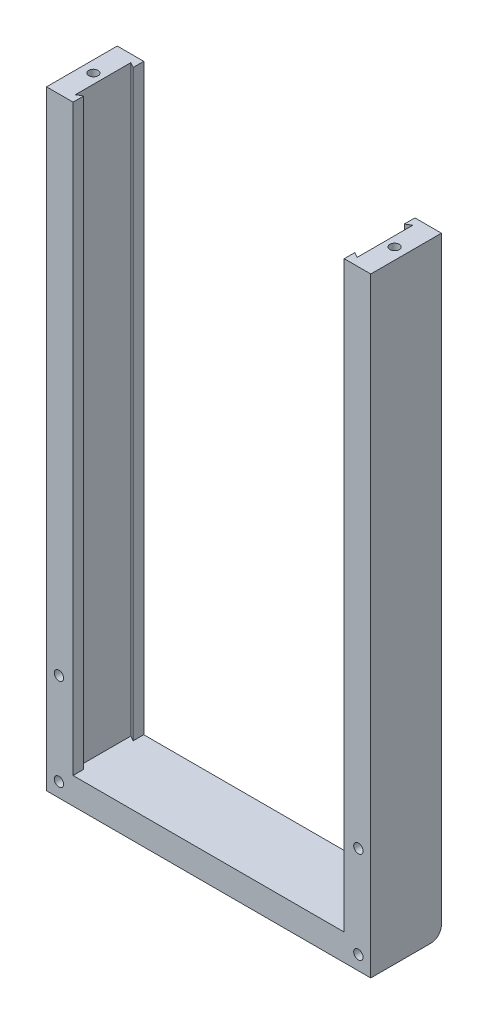
ISO-10303-21;
HEADER;
FILE_DESCRIPTION(('STEP AP214'),'2;1');
FILE_NAME('part.step','',(''),(''),'','','');
FILE_SCHEMA(('AUTOMOTIVE_DESIGN { 1 0 10303 214 1 1 1 1 }'));
ENDSEC;
DATA;
#1=APPLICATION_CONTEXT('core data for automotive mechanical design processes');
#2=APPLICATION_PROTOCOL_DEFINITION('international standard','automotive_design',2000,#1);
#3=PRODUCT_CONTEXT('',#1,'mechanical');
#4=PRODUCT('Part','Part','',(#3));
#5=PRODUCT_RELATED_PRODUCT_CATEGORY('part','',(#4));
#6=PRODUCT_DEFINITION_FORMATION('','',#4);
#7=PRODUCT_DEFINITION_CONTEXT('part definition',#1,'design');
#8=PRODUCT_DEFINITION('design','',#6,#7);
#9=PRODUCT_DEFINITION_SHAPE('','',#8);
#10=(LENGTH_UNIT() NAMED_UNIT(*) SI_UNIT(.MILLI.,.METRE.));
#11=(NAMED_UNIT(*) PLANE_ANGLE_UNIT() SI_UNIT($,.RADIAN.));
#12=(NAMED_UNIT(*) SI_UNIT($,.STERADIAN.) SOLID_ANGLE_UNIT());
#13=UNCERTAINTY_MEASURE_WITH_UNIT(LENGTH_MEASURE(1.E-05),#10,'distance_accuracy_value','');
#14=(GEOMETRIC_REPRESENTATION_CONTEXT(3) GLOBAL_UNCERTAINTY_ASSIGNED_CONTEXT((#13)) GLOBAL_UNIT_ASSIGNED_CONTEXT((#10,
#11,#12)) REPRESENTATION_CONTEXT('',''));
#15=CARTESIAN_POINT('',(0.,0.,0.));
#16=DIRECTION('',(0.,0.,1.));
#17=DIRECTION('',(1.,0.,0.));
#18=AXIS2_PLACEMENT_3D('',#15,#16,#17);
#19=CARTESIAN_POINT('',(38.36,82.5,-181.964167901266));
#20=DIRECTION('',(-1.,0.,0.));
#21=DIRECTION('',(0.,-1.,0.));
#22=AXIS2_PLACEMENT_3D('',#19,#20,#21);
#23=PLANE('',#22);
#24=DIRECTION('',(0.,1.,0.));
#25=VECTOR('',#24,1.);
#26=CARTESIAN_POINT('',(38.36,-98.3033990841189,17.));
#27=LINE('',#26,#25);
#28=CARTESIAN_POINT('',(38.36,-82.5,17.));
#29=VERTEX_POINT('',#28);
#30=CARTESIAN_POINT('',(38.36,82.5,17.));
#31=VERTEX_POINT('',#30);
#32=EDGE_CURVE('E223',#29,#31,#27,.T.);
#33=ORIENTED_EDGE('',*,*,#32,.F.);
#34=DIRECTION('',(0.,0.,1.));
#35=VECTOR('',#34,1.);
#36=CARTESIAN_POINT('',(38.36,-82.5,-181.964167901266));
#37=LINE('',#36,#35);
#38=CARTESIAN_POINT('',(38.36,-82.5,20.));
#39=VERTEX_POINT('',#38);
#40=EDGE_CURVE('E284',#29,#39,#37,.T.);
#41=ORIENTED_EDGE('',*,*,#40,.T.);
#42=DIRECTION('',(0.,-1.,0.));
#43=VECTOR('',#42,1.);
#44=CARTESIAN_POINT('',(38.36,82.5,20.));
#45=LINE('',#44,#43);
#46=CARTESIAN_POINT('',(38.36,82.5,20.));
#47=VERTEX_POINT('',#46);
#48=EDGE_CURVE('E285',#47,#39,#45,.T.);
#49=ORIENTED_EDGE('',*,*,#48,.F.);
#50=DIRECTION('',(0.,0.,1.));
#51=VECTOR('',#50,1.);
#52=CARTESIAN_POINT('',(38.36,82.5,-181.964167901266));
#53=LINE('',#52,#51);
#54=EDGE_CURVE('E54',#31,#47,#53,.T.);
#55=ORIENTED_EDGE('',*,*,#54,.F.);
#56=EDGE_LOOP('',(#33,#41,#49,#55));
#57=FACE_BOUND('',#56,.T.);
#58=ADVANCED_FACE('F45',(#57),#23,.T.);
#59=CARTESIAN_POINT('',(-38.36,82.5,-181.964167901266));
#60=DIRECTION('',(-1.,0.,0.));
#61=DIRECTION('',(0.,0.,1.));
#62=AXIS2_PLACEMENT_3D('',#59,#60,#61);
#63=PLANE('',#62);
#64=DIRECTION('',(0.,0.,1.));
#65=VECTOR('',#64,1.);
#66=CARTESIAN_POINT('',(-38.36,-82.5,-181.964167901266));
#67=LINE('',#66,#65);
#68=CARTESIAN_POINT('',(-38.36,-82.5,17.));
#69=VERTEX_POINT('',#68);
#70=CARTESIAN_POINT('',(-38.36,-82.5,20.));
#71=VERTEX_POINT('',#70);
#72=EDGE_CURVE('E312',#69,#71,#67,.T.);
#73=ORIENTED_EDGE('',*,*,#72,.F.);
#74=DIRECTION('',(0.,1.,0.));
#75=VECTOR('',#74,1.);
#76=CARTESIAN_POINT('',(-38.36,-98.3033990841189,17.));
#77=LINE('',#76,#75);
#78=CARTESIAN_POINT('',(-38.36,82.5,17.));
#79=VERTEX_POINT('',#78);
#80=EDGE_CURVE('E191',#69,#79,#77,.T.);
#81=ORIENTED_EDGE('',*,*,#80,.T.);
#82=DIRECTION('',(0.,0.,1.));
#83=VECTOR('',#82,1.);
#84=CARTESIAN_POINT('',(-38.36,82.5,-181.964167901266));
#85=LINE('',#84,#83);
#86=CARTESIAN_POINT('',(-38.36,82.5,20.));
#87=VERTEX_POINT('',#86);
#88=EDGE_CURVE('E316',#79,#87,#85,.T.);
#89=ORIENTED_EDGE('',*,*,#88,.T.);
#90=DIRECTION('',(0.,-1.,0.));
#91=VECTOR('',#90,1.);
#92=CARTESIAN_POINT('',(-38.36,82.5,20.));
#93=LINE('',#92,#91);
#94=EDGE_CURVE('E302',#87,#71,#93,.T.);
#95=ORIENTED_EDGE('',*,*,#94,.T.);
#96=EDGE_LOOP('',(#73,#81,#89,#95));
#97=FACE_BOUND('',#96,.T.);
#98=ADVANCED_FACE('F408',(#97),#63,.F.);
#99=CARTESIAN_POINT('',(-45.86,82.5,-0.0100000000000031));
#100=DIRECTION('',(0.,-1.,0.));
#101=DIRECTION('',(0.,0.,-1.));
#102=AXIS2_PLACEMENT_3D('',#99,#100,#101);
#103=PLANE('',#102);
#104=DIRECTION('',(0.,0.,-1.));
#105=VECTOR('',#104,1.);
#106=CARTESIAN_POINT('',(39.86,82.5,17.8660254037844));
#107=LINE('',#106,#105);
#108=CARTESIAN_POINT('',(39.86,82.5,17.8660254037844));
#109=VERTEX_POINT('',#108);
#110=CARTESIAN_POINT('',(39.86,82.5,2.13397459621555));
#111=VERTEX_POINT('',#110);
#112=EDGE_CURVE('E225',#109,#111,#107,.T.);
#113=ORIENTED_EDGE('',*,*,#112,.F.);
#114=DIRECTION('',(0.866025403784438,0.,0.500000000000001));
#115=VECTOR('',#114,1.);
#116=CARTESIAN_POINT('',(38.36,82.5,17.));
#117=LINE('',#116,#115);
#118=EDGE_CURVE('E238',#31,#109,#117,.T.);
#119=ORIENTED_EDGE('',*,*,#118,.F.);
#120=ORIENTED_EDGE('',*,*,#54,.T.);
#121=DIRECTION('',(-1.,0.,0.));
#122=VECTOR('',#121,1.);
#123=CARTESIAN_POINT('',(0.,82.5,20.));
#124=LINE('',#123,#122);
#125=CARTESIAN_POINT('',(45.86,82.5,20.));
#126=VERTEX_POINT('',#125);
#127=EDGE_CURVE('E448',#126,#47,#124,.T.);
#128=ORIENTED_EDGE('',*,*,#127,.F.);
#129=DIRECTION('',(0.,0.,1.));
#130=VECTOR('',#129,1.);
#131=CARTESIAN_POINT('',(45.86,82.5,-0.0100000000000031));
#132=LINE('',#131,#130);
#133=CARTESIAN_POINT('',(45.86,82.5,0.));
#134=VERTEX_POINT('',#133);
#135=EDGE_CURVE('E458',#134,#126,#132,.T.);
#136=ORIENTED_EDGE('',*,*,#135,.F.);
#137=DIRECTION('',(-1.,0.,0.));
#138=VECTOR('',#137,1.);
#139=CARTESIAN_POINT('',(0.,82.5,0.));
#140=LINE('',#139,#138);
#141=CARTESIAN_POINT('',(38.36,82.5,0.));
#142=VERTEX_POINT('',#141);
#143=EDGE_CURVE('E450',#134,#142,#140,.T.);
#144=ORIENTED_EDGE('',*,*,#143,.T.);
#145=CARTESIAN_POINT('',(38.36,82.5,3.00000000000003));
#146=VERTEX_POINT('',#145);
#147=EDGE_CURVE('E11',#142,#146,#53,.T.);
#148=ORIENTED_EDGE('',*,*,#147,.T.);
#149=DIRECTION('',(-0.866025403784435,0.,0.500000000000006));
#150=VECTOR('',#149,1.);
#151=CARTESIAN_POINT('',(39.86,82.5,2.13397459621555));
#152=LINE('',#151,#150);
#153=EDGE_CURVE('E62',#111,#146,#152,.T.);
#154=ORIENTED_EDGE('',*,*,#153,.F.);
#155=EDGE_LOOP('',(#113,#119,#120,#128,#136,#144,#148,#154));
#156=FACE_BOUND('',#155,.T.);
#157=CARTESIAN_POINT('',(42.61,82.5,10.));
#158=DIRECTION('',(0.,-1.,0.));
#159=DIRECTION('',(0.,0.,-1.));
#160=AXIS2_PLACEMENT_3D('',#157,#158,#159);
#161=CIRCLE('',#160,1.3208);
#162=CARTESIAN_POINT('',(42.61,82.5,8.6792));
#163=VERTEX_POINT('',#162);
#164=EDGE_CURVE('E459',#163,#163,#161,.F.);
#165=ORIENTED_EDGE('',*,*,#164,.F.);
#166=EDGE_LOOP('',(#165));
#167=FACE_BOUND('',#166,.T.);
#168=ADVANCED_FACE('F47',(#156,#167),#103,.F.);
#169=ORIENTED_EDGE('',*,*,#88,.F.);
#170=DIRECTION('',(0.866025403784436,0.,-0.500000000000004));
#171=VECTOR('',#170,1.);
#172=CARTESIAN_POINT('',(-38.36,82.5,17.));
#173=LINE('',#172,#171);
#174=CARTESIAN_POINT('',(-39.86,82.5,17.8660254037845));
#175=VERTEX_POINT('',#174);
#176=EDGE_CURVE('E206',#175,#79,#173,.T.);
#177=ORIENTED_EDGE('',*,*,#176,.F.);
#178=DIRECTION('',(0.,0.,1.));
#179=VECTOR('',#178,1.);
#180=CARTESIAN_POINT('',(-39.86,82.5,17.8660254037845));
#181=LINE('',#180,#179);
#182=CARTESIAN_POINT('',(-39.86,82.5,2.13397459621555));
#183=VERTEX_POINT('',#182);
#184=EDGE_CURVE('E200',#183,#175,#181,.T.);
#185=ORIENTED_EDGE('',*,*,#184,.F.);
#186=DIRECTION('',(-0.866025403784436,0.,-0.500000000000004));
#187=VECTOR('',#186,1.);
#188=CARTESIAN_POINT('',(-39.86,82.5,2.13397459621555));
#189=LINE('',#188,#187);
#190=CARTESIAN_POINT('',(-38.36,82.5,3.));
#191=VERTEX_POINT('',#190);
#192=EDGE_CURVE('E211',#191,#183,#189,.T.);
#193=ORIENTED_EDGE('',*,*,#192,.F.);
#194=CARTESIAN_POINT('',(-38.36,82.5,0.));
#195=VERTEX_POINT('',#194);
#196=EDGE_CURVE('E308',#195,#191,#85,.T.);
#197=ORIENTED_EDGE('',*,*,#196,.F.);
#198=CARTESIAN_POINT('',(-45.86,82.5,0.));
#199=VERTEX_POINT('',#198);
#200=EDGE_CURVE('E49',#195,#199,#140,.T.);
#201=ORIENTED_EDGE('',*,*,#200,.T.);
#202=DIRECTION('',(0.,0.,-1.));
#203=VECTOR('',#202,1.);
#204=CARTESIAN_POINT('',(-45.86,82.5,20.));
#205=LINE('',#204,#203);
#206=CARTESIAN_POINT('',(-45.86,82.5,20.));
#207=VERTEX_POINT('',#206);
#208=EDGE_CURVE('E454',#207,#199,#205,.T.);
#209=ORIENTED_EDGE('',*,*,#208,.F.);
#210=EDGE_CURVE('E451',#87,#207,#124,.T.);
#211=ORIENTED_EDGE('',*,*,#210,.F.);
#212=EDGE_LOOP('',(#169,#177,#185,#193,#197,#201,#209,#211));
#213=FACE_BOUND('',#212,.T.);
#214=CARTESIAN_POINT('',(-42.61,82.5,10.));
#215=DIRECTION('',(0.,-1.,0.));
#216=DIRECTION('',(0.,0.,-1.));
#217=AXIS2_PLACEMENT_3D('',#214,#215,#216);
#218=CIRCLE('',#217,1.3208);
#219=CARTESIAN_POINT('',(-42.61,82.5,8.6792));
#220=VERTEX_POINT('',#219);
#221=EDGE_CURVE('E461',#220,#220,#218,.F.);
#222=ORIENTED_EDGE('',*,*,#221,.F.);
#223=EDGE_LOOP('',(#222));
#224=FACE_BOUND('',#223,.T.);
#225=ADVANCED_FACE('F421',(#213,#224),#103,.F.);
#226=CARTESIAN_POINT('',(-42.61,70.,10.));
#227=DIRECTION('',(0.,1.,0.));
#228=DIRECTION('',(0.,0.,1.));
#229=AXIS2_PLACEMENT_3D('',#226,#227,#228);
#230=CONICAL_SURFACE('',#229,1.3208,1.02974425867666);
#231=CARTESIAN_POINT('',(-42.61,69.2063832943884,10.));
#232=VERTEX_POINT('',#231);
#233=VERTEX_LOOP('',#232);
#234=FACE_BOUND('',#233,.T.);
#235=CARTESIAN_POINT('',(-42.61,70.,10.));
#236=DIRECTION('',(0.,1.,0.));
#237=DIRECTION('',(0.,0.,1.));
#238=AXIS2_PLACEMENT_3D('',#235,#236,#237);
#239=CIRCLE('',#238,1.3208);
#240=CARTESIAN_POINT('',(-42.61,70.,11.3208));
#241=VERTEX_POINT('',#240);
#242=EDGE_CURVE('E219',#241,#241,#239,.T.);
#243=ORIENTED_EDGE('',*,*,#242,.T.);
#244=EDGE_LOOP('',(#243));
#245=FACE_BOUND('',#244,.T.);
#246=ADVANCED_FACE('F520',(#234,#245),#230,.F.);
#247=CARTESIAN_POINT('',(-42.61,90.,10.));
#248=DIRECTION('',(0.,1.,0.));
#249=DIRECTION('',(0.,0.,1.));
#250=AXIS2_PLACEMENT_3D('',#247,#248,#249);
#251=CYLINDRICAL_SURFACE('',#250,1.3208);
#252=ORIENTED_EDGE('',*,*,#221,.T.);
#253=EDGE_LOOP('',(#252));
#254=FACE_BOUND('',#253,.T.);
#255=ORIENTED_EDGE('',*,*,#242,.F.);
#256=EDGE_LOOP('',(#255));
#257=FACE_BOUND('',#256,.T.);
#258=ADVANCED_FACE('F526',(#254,#257),#251,.F.);
#259=CARTESIAN_POINT('',(42.61,70.,10.));
#260=DIRECTION('',(0.,1.,0.));
#261=DIRECTION('',(0.,0.,1.));
#262=AXIS2_PLACEMENT_3D('',#259,#260,#261);
#263=CONICAL_SURFACE('',#262,1.3208,1.02974425867666);
#264=CARTESIAN_POINT('',(42.61,69.2063832943884,10.));
#265=VERTEX_POINT('',#264);
#266=VERTEX_LOOP('',#265);
#267=FACE_BOUND('',#266,.T.);
#268=CARTESIAN_POINT('',(42.61,70.,10.));
#269=DIRECTION('',(0.,1.,0.));
#270=DIRECTION('',(0.,0.,1.));
#271=AXIS2_PLACEMENT_3D('',#268,#269,#270);
#272=CIRCLE('',#271,1.3208);
#273=CARTESIAN_POINT('',(42.61,70.,11.3208));
#274=VERTEX_POINT('',#273);
#275=EDGE_CURVE('E245',#274,#274,#272,.T.);
#276=ORIENTED_EDGE('',*,*,#275,.T.);
#277=EDGE_LOOP('',(#276));
#278=FACE_BOUND('',#277,.T.);
#279=ADVANCED_FACE('F364',(#267,#278),#263,.F.);
#280=CARTESIAN_POINT('',(42.61,90.,10.));
#281=DIRECTION('',(0.,1.,0.));
#282=DIRECTION('',(0.,0.,1.));
#283=AXIS2_PLACEMENT_3D('',#280,#281,#282);
#284=CYLINDRICAL_SURFACE('',#283,1.3208);
#285=ORIENTED_EDGE('',*,*,#164,.T.);
#286=EDGE_LOOP('',(#285));
#287=FACE_BOUND('',#286,.T.);
#288=ORIENTED_EDGE('',*,*,#275,.F.);
#289=EDGE_LOOP('',(#288));
#290=FACE_BOUND('',#289,.T.);
#291=ADVANCED_FACE('F392',(#287,#290),#284,.F.);
#292=CARTESIAN_POINT('',(42.36,-60.,0.));
#293=DIRECTION('',(0.,0.,-1.));
#294=DIRECTION('',(-1.,0.,0.));
#295=AXIS2_PLACEMENT_3D('',#292,#293,#294);
#296=CYLINDRICAL_SURFACE('',#295,1.32079999999999);
#297=CARTESIAN_POINT('',(42.36,-60.,20.));
#298=DIRECTION('',(0.,0.,-1.));
#299=DIRECTION('',(-1.,0.,0.));
#300=AXIS2_PLACEMENT_3D('',#297,#298,#299);
#301=CIRCLE('',#300,1.3208);
#302=CARTESIAN_POINT('',(41.0392,-60.,20.));
#303=VERTEX_POINT('',#302);
#304=EDGE_CURVE('E281',#303,#303,#301,.T.);
#305=ORIENTED_EDGE('',*,*,#304,.F.);
#306=EDGE_LOOP('',(#305));
#307=FACE_BOUND('',#306,.T.);
#308=CARTESIAN_POINT('',(42.36,-60.,1.0123737050154));
#309=DIRECTION('',(0.,0.,-1.));
#310=DIRECTION('',(-1.,0.,0.));
#311=AXIS2_PLACEMENT_3D('',#308,#309,#310);
#312=CIRCLE('',#311,1.32079999999998);
#313=CARTESIAN_POINT('',(41.0392,-60.,1.0123737050154));
#314=VERTEX_POINT('',#313);
#315=EDGE_CURVE('E278',#314,#314,#312,.T.);
#316=ORIENTED_EDGE('',*,*,#315,.T.);
#317=EDGE_LOOP('',(#316));
#318=FACE_BOUND('',#317,.T.);
#319=ADVANCED_FACE('F385',(#307,#318),#296,.F.);
#320=CARTESIAN_POINT('',(-42.36,-60.,0.));
#321=DIRECTION('',(0.,0.,-1.));
#322=DIRECTION('',(-1.,0.,0.));
#323=AXIS2_PLACEMENT_3D('',#320,#321,#322);
#324=CYLINDRICAL_SURFACE('',#323,1.32079999999999);
#325=CARTESIAN_POINT('',(-42.36,-60.,20.));
#326=DIRECTION('',(0.,0.,-1.));
#327=DIRECTION('',(-1.,0.,0.));
#328=AXIS2_PLACEMENT_3D('',#325,#326,#327);
#329=CIRCLE('',#328,1.3208);
#330=CARTESIAN_POINT('',(-43.6808,-60.,20.));
#331=VERTEX_POINT('',#330);
#332=EDGE_CURVE('E272',#331,#331,#329,.T.);
#333=ORIENTED_EDGE('',*,*,#332,.F.);
#334=EDGE_LOOP('',(#333));
#335=FACE_BOUND('',#334,.T.);
#336=CARTESIAN_POINT('',(-42.36,-60.,1.0123737050154));
#337=DIRECTION('',(0.,0.,-1.));
#338=DIRECTION('',(-1.,0.,0.));
#339=AXIS2_PLACEMENT_3D('',#336,#337,#338);
#340=CIRCLE('',#339,1.32079999999998);
#341=CARTESIAN_POINT('',(-43.6808,-60.,1.0123737050154));
#342=VERTEX_POINT('',#341);
#343=EDGE_CURVE('E269',#342,#342,#340,.T.);
#344=ORIENTED_EDGE('',*,*,#343,.T.);
#345=EDGE_LOOP('',(#344));
#346=FACE_BOUND('',#345,.T.);
#347=ADVANCED_FACE('F378',(#335,#346),#324,.F.);
#348=CARTESIAN_POINT('',(-42.36,-86.,0.));
#349=DIRECTION('',(0.,0.,-1.));
#350=DIRECTION('',(-1.,0.,0.));
#351=AXIS2_PLACEMENT_3D('',#348,#349,#350);
#352=CYLINDRICAL_SURFACE('',#351,1.32079999999999);
#353=CARTESIAN_POINT('',(-42.36,-86.,20.));
#354=DIRECTION('',(0.,0.,-1.));
#355=DIRECTION('',(-1.,0.,0.));
#356=AXIS2_PLACEMENT_3D('',#353,#354,#355);
#357=CIRCLE('',#356,1.3208);
#358=CARTESIAN_POINT('',(-43.6808,-86.,20.));
#359=VERTEX_POINT('',#358);
#360=EDGE_CURVE('E263',#359,#359,#357,.T.);
#361=ORIENTED_EDGE('',*,*,#360,.F.);
#362=EDGE_LOOP('',(#361));
#363=FACE_BOUND('',#362,.T.);
#364=CARTESIAN_POINT('',(-42.36,-86.,1.0123737050154));
#365=DIRECTION('',(0.,0.,-1.));
#366=DIRECTION('',(-1.,0.,0.));
#367=AXIS2_PLACEMENT_3D('',#364,#365,#366);
#368=CIRCLE('',#367,1.32079999999998);
#369=CARTESIAN_POINT('',(-43.6808,-86.,1.0123737050154));
#370=VERTEX_POINT('',#369);
#371=EDGE_CURVE('E260',#370,#370,#368,.T.);
#372=ORIENTED_EDGE('',*,*,#371,.T.);
#373=EDGE_LOOP('',(#372));
#374=FACE_BOUND('',#373,.T.);
#375=ADVANCED_FACE('F369',(#363,#374),#352,.F.);
#376=CARTESIAN_POINT('',(42.36,-86.,0.));
#377=DIRECTION('',(0.,0.,-1.));
#378=DIRECTION('',(-1.,0.,0.));
#379=AXIS2_PLACEMENT_3D('',#376,#377,#378);
#380=CYLINDRICAL_SURFACE('',#379,1.32079999999999);
#381=CARTESIAN_POINT('',(42.36,-86.,20.));
#382=DIRECTION('',(0.,0.,-1.));
#383=DIRECTION('',(-1.,0.,0.));
#384=AXIS2_PLACEMENT_3D('',#381,#382,#383);
#385=CIRCLE('',#384,1.3208);
#386=CARTESIAN_POINT('',(41.0392,-86.,20.));
#387=VERTEX_POINT('',#386);
#388=EDGE_CURVE('E254',#387,#387,#385,.T.);
#389=ORIENTED_EDGE('',*,*,#388,.F.);
#390=EDGE_LOOP('',(#389));
#391=FACE_BOUND('',#390,.T.);
#392=CARTESIAN_POINT('',(42.36,-86.,1.0123737050154));
#393=DIRECTION('',(0.,0.,-1.));
#394=DIRECTION('',(-1.,0.,0.));
#395=AXIS2_PLACEMENT_3D('',#392,#393,#394);
#396=CIRCLE('',#395,1.32079999999998);
#397=CARTESIAN_POINT('',(41.0392,-86.,1.0123737050154));
#398=VERTEX_POINT('',#397);
#399=EDGE_CURVE('E251',#398,#398,#396,.T.);
#400=ORIENTED_EDGE('',*,*,#399,.T.);
#401=EDGE_LOOP('',(#400));
#402=FACE_BOUND('',#401,.T.);
#403=ADVANCED_FACE('F366',(#391,#402),#380,.F.);
#404=CARTESIAN_POINT('',(42.36,-60.,0.));
#405=DIRECTION('',(0.,0.,-1.));
#406=DIRECTION('',(-1.,0.,0.));
#407=AXIS2_PLACEMENT_3D('',#404,#405,#406);
#408=CONICAL_SURFACE('',#407,2.5273,0.872664625997162);
#409=ORIENTED_EDGE('',*,*,#315,.F.);
#410=EDGE_LOOP('',(#409));
#411=FACE_BOUND('',#410,.T.);
#412=CARTESIAN_POINT('',(42.36,-60.,0.));
#413=DIRECTION('',(0.,0.,-1.));
#414=DIRECTION('',(-1.,0.,0.));
#415=AXIS2_PLACEMENT_3D('',#412,#413,#414);
#416=CIRCLE('',#415,2.5273);
#417=CARTESIAN_POINT('',(39.8327,-60.,0.));
#418=VERTEX_POINT('',#417);
#419=EDGE_CURVE('E275',#418,#418,#416,.T.);
#420=ORIENTED_EDGE('',*,*,#419,.T.);
#421=EDGE_LOOP('',(#420));
#422=FACE_BOUND('',#421,.T.);
#423=ADVANCED_FACE('F368',(#411,#422),#408,.F.);
#424=CARTESIAN_POINT('',(-42.36,-60.,0.));
#425=DIRECTION('',(0.,0.,-1.));
#426=DIRECTION('',(-1.,0.,0.));
#427=AXIS2_PLACEMENT_3D('',#424,#425,#426);
#428=CONICAL_SURFACE('',#427,2.5273,0.872664625997162);
#429=ORIENTED_EDGE('',*,*,#343,.F.);
#430=EDGE_LOOP('',(#429));
#431=FACE_BOUND('',#430,.T.);
#432=CARTESIAN_POINT('',(-42.36,-60.,0.));
#433=DIRECTION('',(0.,0.,-1.));
#434=DIRECTION('',(-1.,0.,0.));
#435=AXIS2_PLACEMENT_3D('',#432,#433,#434);
#436=CIRCLE('',#435,2.5273);
#437=CARTESIAN_POINT('',(-44.8873,-60.,0.));
#438=VERTEX_POINT('',#437);
#439=EDGE_CURVE('E266',#438,#438,#436,.T.);
#440=ORIENTED_EDGE('',*,*,#439,.T.);
#441=EDGE_LOOP('',(#440));
#442=FACE_BOUND('',#441,.T.);
#443=ADVANCED_FACE('F374',(#431,#442),#428,.F.);
#444=CARTESIAN_POINT('',(-42.36,-86.,0.));
#445=DIRECTION('',(0.,0.,-1.));
#446=DIRECTION('',(-1.,0.,0.));
#447=AXIS2_PLACEMENT_3D('',#444,#445,#446);
#448=CONICAL_SURFACE('',#447,2.5273,0.872664625997162);
#449=ORIENTED_EDGE('',*,*,#371,.F.);
#450=EDGE_LOOP('',(#449));
#451=FACE_BOUND('',#450,.T.);
#452=CARTESIAN_POINT('',(-42.36,-86.,0.));
#453=DIRECTION('',(0.,0.,-1.));
#454=DIRECTION('',(-1.,0.,0.));
#455=AXIS2_PLACEMENT_3D('',#452,#453,#454);
#456=CIRCLE('',#455,2.5273);
#457=CARTESIAN_POINT('',(-44.6810440086306,-87.,0.));
#458=VERTEX_POINT('',#457);
#459=CARTESIAN_POINT('',(-40.0389559913694,-87.,0.));
#460=VERTEX_POINT('',#459);
#461=EDGE_CURVE('E257',#458,#460,#456,.T.);
#462=ORIENTED_EDGE('',*,*,#461,.T.);
#463=CARTESIAN_POINT('',(-40.0389559913694,-87.,0.));
#464=CARTESIAN_POINT('',(-40.0746672007074,-87.0829527322938,1.03523045244212E-05));
#465=CARTESIAN_POINT('',(-40.118376490096,-87.1617879689519,0.00343635822426512));
#466=CARTESIAN_POINT('',(-40.2178736925824,-87.3097727750214,0.0151230871636107));
#467=CARTESIAN_POINT('',(-40.2735125161691,-87.3790259420664,0.0233261051520805));
#468=CARTESIAN_POINT('',(-40.4129352414555,-87.5287712343353,0.0457087707340424));
#469=CARTESIAN_POINT('',(-40.5000627942329,-87.6059259609096,0.0609572622816848));
#470=CARTESIAN_POINT('',(-40.6856228426901,-87.7456955268742,0.0932648182906404));
#471=CARTESIAN_POINT('',(-40.7841220728637,-87.8082172636989,0.110334521046776));
#472=CARTESIAN_POINT('',(-40.9561840042566,-87.9016009022184,0.138415631086957));
#473=CARTESIAN_POINT('',(-41.0277306765774,-87.9362113557195,0.149629301001186));
#474=CARTESIAN_POINT('',(-41.1736749747485,-87.9992278167268,0.171103562109984));
#475=CARTESIAN_POINT('',(-41.2480734977284,-88.0276318526875,0.181363849857702));
#476=CARTESIAN_POINT('',(-41.3989767643073,-88.0784035249866,0.200396657951816));
#477=CARTESIAN_POINT('',(-41.4754789182236,-88.1007782466885,0.209170920058286));
#478=CARTESIAN_POINT('',(-41.6301446744133,-88.139687903232,0.224833083615228));
#479=CARTESIAN_POINT('',(-41.7083083581417,-88.1562225510656,0.231720892353053));
#480=CARTESIAN_POINT('',(-41.8669853690656,-88.183750824595,0.243378686821178));
#481=CARTESIAN_POINT('',(-41.9475163533985,-88.1946568373727,0.248115056159762));
#482=CARTESIAN_POINT('',(-42.1092303195186,-88.2105969098773,0.255090022110118));
#483=CARTESIAN_POINT('',(-42.1904130203015,-88.2156333764802,0.257329642526562));
#484=CARTESIAN_POINT('',(-42.353031977118,-88.2198664779763,0.259209729436489));
#485=CARTESIAN_POINT('',(-42.4344683927229,-88.2190580061821,0.258847923080627));
#486=CARTESIAN_POINT('',(-42.5969952258279,-88.2115869844207,0.255537714762573));
#487=CARTESIAN_POINT('',(-42.6780857341156,-88.2049260793655,0.252590039597008));
#488=CARTESIAN_POINT('',(-42.8452226641936,-88.1850339300914,0.243948150284412));
#489=CARTESIAN_POINT('',(-42.9312082544857,-88.171366431253,0.238072409507027));
#490=CARTESIAN_POINT('',(-43.1015690970066,-88.1372014882568,0.223830971472459));
#491=CARTESIAN_POINT('',(-43.1859449331253,-88.116706572326,0.215466196039606));
#492=CARTESIAN_POINT('',(-43.3524547493647,-88.0687409947388,0.196706054877921));
#493=CARTESIAN_POINT('',(-43.4345890809195,-88.0412714336418,0.186311009573814));
#494=CARTESIAN_POINT('',(-43.5958484073821,-87.9791388670964,0.164092348184311));
#495=CARTESIAN_POINT('',(-43.6749747316648,-87.9444790841123,0.152269373047105));
#496=CARTESIAN_POINT('',(-43.8557572412446,-87.8545091590748,0.12375993814294));
#497=CARTESIAN_POINT('',(-43.9558995935407,-87.7961871037526,0.106789372472424));
#498=CARTESIAN_POINT('',(-44.1463459964742,-87.6649607004934,0.0738423542896442));
#499=CARTESIAN_POINT('',(-44.2366639177431,-87.5920773347522,0.0578645142412403));
#500=CARTESIAN_POINT('',(-44.3800296272149,-87.4530936621082,0.0338243627948351));
#501=CARTESIAN_POINT('',(-44.4364777546715,-87.390689524802,0.0247949382407334));
#502=CARTESIAN_POINT('',(-44.5393306585089,-87.2579340692584,0.0103674644215374));
#503=CARTESIAN_POINT('',(-44.585773166425,-87.1876141861276,0.00495560477265844));
#504=CARTESIAN_POINT('',(-44.6583628899315,-87.0536359545809,-0.000120119211866144));
#505=CARTESIAN_POINT('',(-44.6866835505649,-86.9912064111533,-0.000672538237467327));
#506=CARTESIAN_POINT('',(-44.7217643251322,-86.8946631759709,0.00167439396310656));
#507=CARTESIAN_POINT('',(-44.7322558326613,-86.8618392740115,0.00299966591408045));
#508=CARTESIAN_POINT('',(-44.7505599755555,-86.7954810981054,0.00679410367696422));
#509=CARTESIAN_POINT('',(-44.7583697271001,-86.7619461003576,0.00926449422556562));
#510=CARTESIAN_POINT('',(-44.7647631604708,-86.7281767650932,0.0123400245401359));
#511=B_SPLINE_CURVE_WITH_KNOTS('',3,(#463,#464,#465,#466,#467,#468,#469,#470,#471,#472,#473,
#474,#475,#476,#477,#478,#479,#480,#481,#482,#483,#484,#485,#486,#487,#488,#489,#490,#491,#492,
#493,#494,#495,#496,#497,#498,#499,#500,#501,#502,#503,#504,#505,#506,#507,#508,#509,#510),
.UNSPECIFIED.,.F.,.F.,(4,2,2,2,2,2,2,2,2,2,2,2,2,2,2,2,2,2,2,2,2,2,2,4),(0.,0.26953352133639,
0.535876768945289,0.886167662471534,1.23863012077693,1.47914790985754,1.71974199168374,
1.96005209342722,2.20037400346116,2.44433167342446,2.68818927045872,2.93225995013361,
3.17626205210929,3.4377332216343,3.69910767449622,3.96044090955696,4.22165727413183,
4.57191207112381,4.92166576023076,5.17471685241217,5.42679629610489,5.63153853244835,
5.73487630532507,5.83832485678823),.UNSPECIFIED.);
#512=EDGE_CURVE('E347',#460,#458,#511,.T.);
#513=ORIENTED_EDGE('',*,*,#512,.T.);
#514=EDGE_LOOP('',(#462,#513));
#515=FACE_BOUND('',#514,.T.);
#516=ADVANCED_FACE('F362',(#451,#515),#448,.F.);
#517=CARTESIAN_POINT('',(42.36,-86.,0.));
#518=DIRECTION('',(0.,0.,-1.));
#519=DIRECTION('',(-1.,0.,0.));
#520=AXIS2_PLACEMENT_3D('',#517,#518,#519);
#521=CONICAL_SURFACE('',#520,2.5273,0.872664625997162);
#522=ORIENTED_EDGE('',*,*,#399,.F.);
#523=EDGE_LOOP('',(#522));
#524=FACE_BOUND('',#523,.T.);
#525=CARTESIAN_POINT('',(42.36,-86.,0.));
#526=DIRECTION('',(0.,0.,-1.));
#527=DIRECTION('',(-1.,0.,0.));
#528=AXIS2_PLACEMENT_3D('',#525,#526,#527);
#529=CIRCLE('',#528,2.5273);
#530=CARTESIAN_POINT('',(40.0389559913694,-87.,0.));
#531=VERTEX_POINT('',#530);
#532=CARTESIAN_POINT('',(44.6810440086306,-87.,0.));
#533=VERTEX_POINT('',#532);
#534=EDGE_CURVE('E248',#531,#533,#529,.T.);
#535=ORIENTED_EDGE('',*,*,#534,.T.);
#536=CARTESIAN_POINT('',(44.6810440086306,-87.,0.));
#537=CARTESIAN_POINT('',(44.6453327992926,-87.0829527322938,1.03523045244212E-05));
#538=CARTESIAN_POINT('',(44.601623509904,-87.1617879689519,0.00343635822426512));
#539=CARTESIAN_POINT('',(44.5021263074176,-87.3097727750214,0.0151230871636107));
#540=CARTESIAN_POINT('',(44.4464874838309,-87.3790259420664,0.0233261051520805));
#541=CARTESIAN_POINT('',(44.3070647585445,-87.5287712343353,0.0457087707340424));
#542=CARTESIAN_POINT('',(44.2199372057671,-87.6059259609096,0.0609572622816848));
#543=CARTESIAN_POINT('',(44.0343771573098,-87.7456955268742,0.0932648182906403));
#544=CARTESIAN_POINT('',(43.9358779271363,-87.8082172636989,0.110334521046776));
#545=CARTESIAN_POINT('',(43.7638159957434,-87.9016009022184,0.138415631086957));
#546=CARTESIAN_POINT('',(43.6922693234226,-87.9362113557195,0.149629301001186));
#547=CARTESIAN_POINT('',(43.5463250252515,-87.9992278167268,0.171103562109984));
#548=CARTESIAN_POINT('',(43.4719265022716,-88.0276318526875,0.181363849857702));
#549=CARTESIAN_POINT('',(43.3210232356927,-88.0784035249866,0.200396657951817));
#550=CARTESIAN_POINT('',(43.2445210817764,-88.1007782466885,0.209170920058286));
#551=CARTESIAN_POINT('',(43.0898553255867,-88.139687903232,0.224833083615228));
#552=CARTESIAN_POINT('',(43.0116916418582,-88.1562225510656,0.231720892353053));
#553=CARTESIAN_POINT('',(42.8530146309343,-88.183750824595,0.243378686821177));
#554=CARTESIAN_POINT('',(42.7724836466014,-88.1946568373727,0.248115056159762));
#555=CARTESIAN_POINT('',(42.6107696804814,-88.2105969098773,0.255090022110118));
#556=CARTESIAN_POINT('',(42.5295869796985,-88.2156333764802,0.257329642526562));
#557=CARTESIAN_POINT('',(42.366968022882,-88.2198664779763,0.259209729436489));
#558=CARTESIAN_POINT('',(42.2855316072771,-88.2190580061821,0.258847923080627));
#559=CARTESIAN_POINT('',(42.1230047741721,-88.2115869844207,0.255537714762573));
#560=CARTESIAN_POINT('',(42.0419142658844,-88.2049260793655,0.252590039597008));
#561=CARTESIAN_POINT('',(41.8747773358064,-88.1850339300914,0.243948150284412));
#562=CARTESIAN_POINT('',(41.7887917455143,-88.171366431253,0.238072409507027));
#563=CARTESIAN_POINT('',(41.6184309029934,-88.1372014882568,0.223830971472459));
#564=CARTESIAN_POINT('',(41.5340550668746,-88.116706572326,0.215466196039606));
#565=CARTESIAN_POINT('',(41.3675452506353,-88.0687409947388,0.196706054877921));
#566=CARTESIAN_POINT('',(41.2854109190805,-88.0412714336418,0.186311009573814));
#567=CARTESIAN_POINT('',(41.1241515926178,-87.9791388670964,0.164092348184312));
#568=CARTESIAN_POINT('',(41.0450252683352,-87.9444790841123,0.152269373047105));
#569=CARTESIAN_POINT('',(40.8642427587554,-87.8545091590748,0.12375993814294));
#570=CARTESIAN_POINT('',(40.7641004064593,-87.7961871037526,0.106789372472424));
#571=CARTESIAN_POINT('',(40.5736540035258,-87.6649607004934,0.0738423542896442));
#572=CARTESIAN_POINT('',(40.4833360822569,-87.5920773347522,0.0578645142412403));
#573=CARTESIAN_POINT('',(40.3399703727851,-87.4530936621082,0.0338243627948351));
#574=CARTESIAN_POINT('',(40.2835222453285,-87.390689524802,0.0247949382407334));
#575=CARTESIAN_POINT('',(40.1806693414911,-87.2579340692584,0.0103674644215374));
#576=CARTESIAN_POINT('',(40.134226833575,-87.1876141861276,0.00495560477265844));
#577=CARTESIAN_POINT('',(40.0616371100685,-87.0536359545809,-0.000120119211866144));
#578=CARTESIAN_POINT('',(40.0333164494351,-86.9912064111533,-0.000672538237467327));
#579=CARTESIAN_POINT('',(39.9982356748678,-86.8946631759709,0.00167439396310656));
#580=CARTESIAN_POINT('',(39.9877441673387,-86.8618392740115,0.00299966591408045));
#581=CARTESIAN_POINT('',(39.9694400244445,-86.7954810981054,0.00679410367696422));
#582=CARTESIAN_POINT('',(39.9616302728999,-86.7619461003576,0.00926449422556562));
#583=CARTESIAN_POINT('',(39.9552368395292,-86.7281767650932,0.0123400245401359));
#584=B_SPLINE_CURVE_WITH_KNOTS('',3,(#536,#537,#538,#539,#540,#541,#542,#543,#544,#545,#546,
#547,#548,#549,#550,#551,#552,#553,#554,#555,#556,#557,#558,#559,#560,#561,#562,#563,#564,#565,
#566,#567,#568,#569,#570,#571,#572,#573,#574,#575,#576,#577,#578,#579,#580,#581,#582,#583),
.UNSPECIFIED.,.F.,.F.,(4,2,2,2,2,2,2,2,2,2,2,2,2,2,2,2,2,2,2,2,2,2,2,4),(0.,0.26953352133639,
0.535876768945289,0.886167662471534,1.23863012077693,1.47914790985754,1.71974199168374,
1.96005209342723,2.20037400346116,2.44433167342445,2.68818927045872,2.93225995013361,
3.17626205210929,3.4377332216343,3.69910767449622,3.96044090955695,4.22165727413183,
4.57191207112381,4.92166576023076,5.17471685241217,5.42679629610489,5.63153853244835,
5.73487630532506,5.83832485678823),.UNSPECIFIED.);
#585=EDGE_CURVE('E340',#533,#531,#584,.T.);
#586=ORIENTED_EDGE('',*,*,#585,.T.);
#587=EDGE_LOOP('',(#535,#586));
#588=FACE_BOUND('',#587,.T.);
#589=ADVANCED_FACE('F357',(#524,#588),#521,.F.);
#590=CARTESIAN_POINT('',(-45.86,-87.,3.));
#591=DIRECTION('',(-1.,0.,0.));
#592=DIRECTION('',(0.,0.,1.));
#593=AXIS2_PLACEMENT_3D('',#590,#591,#592);
#594=CYLINDRICAL_SURFACE('',#593,3.);
#595=DIRECTION('',(1.,0.,0.));
#596=VECTOR('',#595,1.);
#597=CARTESIAN_POINT('',(-45.86,-90.,3.));
#598=LINE('',#597,#596);
#599=CARTESIAN_POINT('',(-45.86,-90.,3.));
#600=VERTEX_POINT('',#599);
#601=CARTESIAN_POINT('',(45.86,-90.,3.));
#602=VERTEX_POINT('',#601);
#603=EDGE_CURVE('E328',#600,#602,#598,.T.);
#604=ORIENTED_EDGE('',*,*,#603,.F.);
#605=CARTESIAN_POINT('',(-45.86,-87.,3.));
#606=DIRECTION('',(1.,0.,0.));
#607=DIRECTION('',(0.,1.,0.));
#608=AXIS2_PLACEMENT_3D('',#605,#606,#607);
#609=CIRCLE('',#608,3.);
#610=CARTESIAN_POINT('',(-45.86,-87.,0.));
#611=VERTEX_POINT('',#610);
#612=EDGE_CURVE('E469',#611,#600,#609,.F.);
#613=ORIENTED_EDGE('',*,*,#612,.F.);
#614=DIRECTION('',(1.,0.,0.));
#615=VECTOR('',#614,1.);
#616=CARTESIAN_POINT('',(-45.86,-87.,0.));
#617=LINE('',#616,#615);
#618=EDGE_CURVE('E331',#458,#611,#617,.F.);
#619=ORIENTED_EDGE('',*,*,#618,.F.);
#620=ORIENTED_EDGE('',*,*,#512,.F.);
#621=DIRECTION('',(1.,0.,0.));
#622=VECTOR('',#621,1.);
#623=CARTESIAN_POINT('',(-45.86,-87.,0.));
#624=LINE('',#623,#622);
#625=EDGE_CURVE('E334',#531,#460,#624,.F.);
#626=ORIENTED_EDGE('',*,*,#625,.F.);
#627=ORIENTED_EDGE('',*,*,#585,.F.);
#628=DIRECTION('',(1.,0.,0.));
#629=VECTOR('',#628,1.);
#630=CARTESIAN_POINT('',(-45.86,-87.,0.));
#631=LINE('',#630,#629);
#632=CARTESIAN_POINT('',(45.86,-87.,0.));
#633=VERTEX_POINT('',#632);
#634=EDGE_CURVE('E337',#633,#533,#631,.F.);
#635=ORIENTED_EDGE('',*,*,#634,.F.);
#636=CARTESIAN_POINT('',(45.86,-87.,3.));
#637=DIRECTION('',(1.,0.,0.));
#638=DIRECTION('',(0.,1.,0.));
#639=AXIS2_PLACEMENT_3D('',#636,#637,#638);
#640=CIRCLE('',#639,3.);
#641=EDGE_CURVE('E465',#602,#633,#640,.T.);
#642=ORIENTED_EDGE('',*,*,#641,.F.);
#643=EDGE_LOOP('',(#604,#613,#619,#620,#626,#627,#635,#642));
#644=FACE_BOUND('',#643,.T.);
#645=ADVANCED_FACE('F354',(#644),#594,.T.);
#646=CARTESIAN_POINT('',(-45.86,-90.,20.));
#647=DIRECTION('',(0.,1.,0.));
#648=DIRECTION('',(0.,0.,1.));
#649=AXIS2_PLACEMENT_3D('',#646,#647,#648);
#650=PLANE('',#649);
#651=DIRECTION('',(0.,0.,-1.));
#652=VECTOR('',#651,1.);
#653=CARTESIAN_POINT('',(-45.86,-90.,20.));
#654=LINE('',#653,#652);
#655=CARTESIAN_POINT('',(-45.86,-90.,20.));
#656=VERTEX_POINT('',#655);
#657=EDGE_CURVE('E324',#656,#600,#654,.T.);
#658=ORIENTED_EDGE('',*,*,#657,.T.);
#659=ORIENTED_EDGE('',*,*,#603,.T.);
#660=DIRECTION('',(0.,0.,-1.));
#661=VECTOR('',#660,1.);
#662=CARTESIAN_POINT('',(45.86,-90.,20.));
#663=LINE('',#662,#661);
#664=CARTESIAN_POINT('',(45.86,-90.,20.));
#665=VERTEX_POINT('',#664);
#666=EDGE_CURVE('E297',#665,#602,#663,.T.);
#667=ORIENTED_EDGE('',*,*,#666,.F.);
#668=DIRECTION('',(1.,0.,0.));
#669=VECTOR('',#668,1.);
#670=CARTESIAN_POINT('',(-45.86,-90.,20.));
#671=LINE('',#670,#669);
#672=EDGE_CURVE('E319',#656,#665,#671,.T.);
#673=ORIENTED_EDGE('',*,*,#672,.F.);
#674=EDGE_LOOP('',(#658,#659,#667,#673));
#675=FACE_BOUND('',#674,.T.);
#676=ADVANCED_FACE('F414',(#675),#650,.F.);
#677=CARTESIAN_POINT('',(0.,0.,20.));
#678=DIRECTION('',(0.,0.,-1.));
#679=DIRECTION('',(-1.,0.,0.));
#680=AXIS2_PLACEMENT_3D('',#677,#678,#679);
#681=PLANE('',#680);
#682=ORIENTED_EDGE('',*,*,#388,.T.);
#683=EDGE_LOOP('',(#682));
#684=FACE_BOUND('',#683,.T.);
#685=ORIENTED_EDGE('',*,*,#360,.T.);
#686=EDGE_LOOP('',(#685));
#687=FACE_BOUND('',#686,.T.);
#688=ORIENTED_EDGE('',*,*,#332,.T.);
#689=EDGE_LOOP('',(#688));
#690=FACE_BOUND('',#689,.T.);
#691=ORIENTED_EDGE('',*,*,#304,.T.);
#692=EDGE_LOOP('',(#691));
#693=FACE_BOUND('',#692,.T.);
#694=DIRECTION('',(0.,-1.,0.));
#695=VECTOR('',#694,1.);
#696=CARTESIAN_POINT('',(45.86,90.,20.));
#697=LINE('',#696,#695);
#698=EDGE_CURVE('E295',#126,#665,#697,.T.);
#699=ORIENTED_EDGE('',*,*,#698,.F.);
#700=ORIENTED_EDGE('',*,*,#127,.T.);
#701=ORIENTED_EDGE('',*,*,#48,.T.);
#702=DIRECTION('',(1.,0.,0.));
#703=VECTOR('',#702,1.);
#704=CARTESIAN_POINT('',(-38.36,-82.5,20.));
#705=LINE('',#704,#703);
#706=EDGE_CURVE('E306',#71,#39,#705,.T.);
#707=ORIENTED_EDGE('',*,*,#706,.F.);
#708=ORIENTED_EDGE('',*,*,#94,.F.);
#709=ORIENTED_EDGE('',*,*,#210,.T.);
#710=DIRECTION('',(0.,-1.,0.));
#711=VECTOR('',#710,1.);
#712=CARTESIAN_POINT('',(-45.86,90.,20.));
#713=LINE('',#712,#711);
#714=EDGE_CURVE('E322',#207,#656,#713,.T.);
#715=ORIENTED_EDGE('',*,*,#714,.T.);
#716=ORIENTED_EDGE('',*,*,#672,.T.);
#717=EDGE_LOOP('',(#699,#700,#701,#707,#708,#709,#715,#716));
#718=FACE_BOUND('',#717,.T.);
#719=ADVANCED_FACE('F411',(#684,#687,#690,#693,#718),#681,.F.);
#720=CARTESIAN_POINT('',(-38.36,-82.5,-181.964167901266));
#721=DIRECTION('',(0.,-1.,0.));
#722=DIRECTION('',(0.,0.,-1.));
#723=AXIS2_PLACEMENT_3D('',#720,#721,#722);
#724=PLANE('',#723);
#725=ORIENTED_EDGE('',*,*,#706,.T.);
#726=ORIENTED_EDGE('',*,*,#40,.F.);
#727=DIRECTION('',(0.866025403784438,0.,0.500000000000001));
#728=VECTOR('',#727,1.);
#729=CARTESIAN_POINT('',(38.36,-82.5,17.));
#730=LINE('',#729,#728);
#731=CARTESIAN_POINT('',(39.86,-82.5,17.8660254037844));
#732=VERTEX_POINT('',#731);
#733=EDGE_CURVE('E226',#29,#732,#730,.T.);
#734=ORIENTED_EDGE('',*,*,#733,.T.);
#735=DIRECTION('',(0.,0.,-1.));
#736=VECTOR('',#735,1.);
#737=CARTESIAN_POINT('',(39.86,-82.5,17.8660254037844));
#738=LINE('',#737,#736);
#739=CARTESIAN_POINT('',(39.86,-82.5,2.13397459621555));
#740=VERTEX_POINT('',#739);
#741=EDGE_CURVE('E229',#732,#740,#738,.T.);
#742=ORIENTED_EDGE('',*,*,#741,.T.);
#743=DIRECTION('',(-0.866025403784435,0.,0.500000000000006));
#744=VECTOR('',#743,1.);
#745=CARTESIAN_POINT('',(39.86,-82.5,2.13397459621555));
#746=LINE('',#745,#744);
#747=CARTESIAN_POINT('',(38.36,-82.5,3.00000000000001));
#748=VERTEX_POINT('',#747);
#749=EDGE_CURVE('E222',#740,#748,#746,.T.);
#750=ORIENTED_EDGE('',*,*,#749,.T.);
#751=CARTESIAN_POINT('',(38.36,-82.5,0.));
#752=VERTEX_POINT('',#751);
#753=EDGE_CURVE('E289',#752,#748,#37,.T.);
#754=ORIENTED_EDGE('',*,*,#753,.F.);
#755=DIRECTION('',(1.,0.,0.));
#756=VECTOR('',#755,1.);
#757=CARTESIAN_POINT('',(-38.36,-82.5,0.));
#758=LINE('',#757,#756);
#759=CARTESIAN_POINT('',(-38.36,-82.5,0.));
#760=VERTEX_POINT('',#759);
#761=EDGE_CURVE('E301',#760,#752,#758,.T.);
#762=ORIENTED_EDGE('',*,*,#761,.F.);
#763=CARTESIAN_POINT('',(-38.36,-82.5,3.));
#764=VERTEX_POINT('',#763);
#765=EDGE_CURVE('E314',#760,#764,#67,.T.);
#766=ORIENTED_EDGE('',*,*,#765,.T.);
#767=DIRECTION('',(-0.866025403784436,0.,-0.500000000000004));
#768=VECTOR('',#767,1.);
#769=CARTESIAN_POINT('',(-39.86,-82.5,2.13397459621555));
#770=LINE('',#769,#768);
#771=CARTESIAN_POINT('',(-39.86,-82.5,2.13397459621555));
#772=VERTEX_POINT('',#771);
#773=EDGE_CURVE('E70',#764,#772,#770,.T.);
#774=ORIENTED_EDGE('',*,*,#773,.T.);
#775=DIRECTION('',(0.,0.,1.));
#776=VECTOR('',#775,1.);
#777=CARTESIAN_POINT('',(-39.86,-82.5,17.8660254037845));
#778=LINE('',#777,#776);
#779=CARTESIAN_POINT('',(-39.86,-82.5,17.8660254037845));
#780=VERTEX_POINT('',#779);
#781=EDGE_CURVE('E198',#772,#780,#778,.T.);
#782=ORIENTED_EDGE('',*,*,#781,.T.);
#783=DIRECTION('',(0.866025403784436,0.,-0.500000000000005));
#784=VECTOR('',#783,1.);
#785=CARTESIAN_POINT('',(-38.36,-82.5,17.));
#786=LINE('',#785,#784);
#787=EDGE_CURVE('E185',#780,#69,#786,.T.);
#788=ORIENTED_EDGE('',*,*,#787,.T.);
#789=ORIENTED_EDGE('',*,*,#72,.T.);
#790=EDGE_LOOP('',(#725,#726,#734,#742,#750,#754,#762,#766,#774,#782,#788,#789));
#791=FACE_BOUND('',#790,.T.);
#792=ADVANCED_FACE('F204',(#791),#724,.F.);
#793=CARTESIAN_POINT('',(0.,0.,0.));
#794=DIRECTION('',(0.,0.,-1.));
#795=DIRECTION('',(-1.,0.,0.));
#796=AXIS2_PLACEMENT_3D('',#793,#794,#795);
#797=PLANE('',#796);
#798=ORIENTED_EDGE('',*,*,#143,.F.);
#799=DIRECTION('',(0.,-1.,0.));
#800=VECTOR('',#799,1.);
#801=CARTESIAN_POINT('',(45.86,90.,0.));
#802=LINE('',#801,#800);
#803=EDGE_CURVE('E291',#134,#633,#802,.T.);
#804=ORIENTED_EDGE('',*,*,#803,.T.);
#805=ORIENTED_EDGE('',*,*,#634,.T.);
#806=ORIENTED_EDGE('',*,*,#534,.F.);
#807=ORIENTED_EDGE('',*,*,#625,.T.);
#808=ORIENTED_EDGE('',*,*,#461,.F.);
#809=ORIENTED_EDGE('',*,*,#618,.T.);
#810=DIRECTION('',(0.,-1.,0.));
#811=VECTOR('',#810,1.);
#812=CARTESIAN_POINT('',(-45.86,90.,0.));
#813=LINE('',#812,#811);
#814=EDGE_CURVE('E305',#199,#611,#813,.T.);
#815=ORIENTED_EDGE('',*,*,#814,.F.);
#816=ORIENTED_EDGE('',*,*,#200,.F.);
#817=DIRECTION('',(0.,-1.,0.));
#818=VECTOR('',#817,1.);
#819=CARTESIAN_POINT('',(-38.36,82.5,0.));
#820=LINE('',#819,#818);
#821=EDGE_CURVE('E309',#195,#760,#820,.T.);
#822=ORIENTED_EDGE('',*,*,#821,.T.);
#823=ORIENTED_EDGE('',*,*,#761,.T.);
#824=DIRECTION('',(0.,-1.,0.));
#825=VECTOR('',#824,1.);
#826=CARTESIAN_POINT('',(38.36,82.5,0.));
#827=LINE('',#826,#825);
#828=EDGE_CURVE('E288',#142,#752,#827,.T.);
#829=ORIENTED_EDGE('',*,*,#828,.F.);
#830=EDGE_LOOP('',(#798,#804,#805,#806,#807,#808,#809,#815,#816,#822,#823,#829));
#831=FACE_BOUND('',#830,.T.);
#832=ORIENTED_EDGE('',*,*,#439,.F.);
#833=EDGE_LOOP('',(#832));
#834=FACE_BOUND('',#833,.T.);
#835=ORIENTED_EDGE('',*,*,#419,.F.);
#836=EDGE_LOOP('',(#835));
#837=FACE_BOUND('',#836,.T.);
#838=ADVANCED_FACE('F398',(#831,#834,#837),#797,.T.);
#839=DIRECTION('',(0.,1.,0.));
#840=VECTOR('',#839,1.);
#841=CARTESIAN_POINT('',(38.36,-98.3033990841189,3.00000000000001));
#842=LINE('',#841,#840);
#843=EDGE_CURVE('E220',#748,#146,#842,.T.);
#844=ORIENTED_EDGE('',*,*,#843,.T.);
#845=ORIENTED_EDGE('',*,*,#147,.F.);
#846=ORIENTED_EDGE('',*,*,#828,.T.);
#847=ORIENTED_EDGE('',*,*,#753,.T.);
#848=EDGE_LOOP('',(#844,#845,#846,#847));
#849=FACE_BOUND('',#848,.T.);
#850=ADVANCED_FACE('F394',(#849),#23,.T.);
#851=CARTESIAN_POINT('',(45.86,90.,20.));
#852=DIRECTION('',(1.,0.,0.));
#853=DIRECTION('',(0.,1.,0.));
#854=AXIS2_PLACEMENT_3D('',#851,#852,#853);
#855=PLANE('',#854);
#856=ORIENTED_EDGE('',*,*,#803,.F.);
#857=ORIENTED_EDGE('',*,*,#135,.T.);
#858=ORIENTED_EDGE('',*,*,#698,.T.);
#859=ORIENTED_EDGE('',*,*,#666,.T.);
#860=ORIENTED_EDGE('',*,*,#641,.T.);
#861=EDGE_LOOP('',(#856,#857,#858,#859,#860));
#862=FACE_BOUND('',#861,.T.);
#863=ADVANCED_FACE('F397',(#862),#855,.T.);
#864=ORIENTED_EDGE('',*,*,#196,.T.);
#865=DIRECTION('',(0.,1.,0.));
#866=VECTOR('',#865,1.);
#867=CARTESIAN_POINT('',(-38.36,-98.3033990841189,3.));
#868=LINE('',#867,#866);
#869=EDGE_CURVE('E214',#764,#191,#868,.T.);
#870=ORIENTED_EDGE('',*,*,#869,.F.);
#871=ORIENTED_EDGE('',*,*,#765,.F.);
#872=ORIENTED_EDGE('',*,*,#821,.F.);
#873=EDGE_LOOP('',(#864,#870,#871,#872));
#874=FACE_BOUND('',#873,.T.);
#875=ADVANCED_FACE('F402',(#874),#63,.F.);
#876=CARTESIAN_POINT('',(-45.86,90.,20.));
#877=DIRECTION('',(1.,0.,0.));
#878=DIRECTION('',(0.,1.,0.));
#879=AXIS2_PLACEMENT_3D('',#876,#877,#878);
#880=PLANE('',#879);
#881=ORIENTED_EDGE('',*,*,#714,.F.);
#882=ORIENTED_EDGE('',*,*,#208,.T.);
#883=ORIENTED_EDGE('',*,*,#814,.T.);
#884=ORIENTED_EDGE('',*,*,#612,.T.);
#885=ORIENTED_EDGE('',*,*,#657,.F.);
#886=EDGE_LOOP('',(#881,#882,#883,#884,#885));
#887=FACE_BOUND('',#886,.T.);
#888=ADVANCED_FACE('F406',(#887),#880,.F.);
#889=CARTESIAN_POINT('',(-39.86,-98.3033990841189,17.8660254037845));
#890=DIRECTION('',(-1.,0.,0.));
#891=DIRECTION('',(0.,0.,1.));
#892=AXIS2_PLACEMENT_3D('',#889,#890,#891);
#893=PLANE('',#892);
#894=DIRECTION('',(0.,1.,0.));
#895=VECTOR('',#894,1.);
#896=CARTESIAN_POINT('',(-39.86,-98.3033990841189,2.13397459621555));
#897=LINE('',#896,#895);
#898=EDGE_CURVE('E213',#772,#183,#897,.T.);
#899=ORIENTED_EDGE('',*,*,#898,.T.);
#900=ORIENTED_EDGE('',*,*,#184,.T.);
#901=DIRECTION('',(0.,1.,0.));
#902=VECTOR('',#901,1.);
#903=CARTESIAN_POINT('',(-39.86,-98.3033990841189,17.8660254037845));
#904=LINE('',#903,#902);
#905=EDGE_CURVE('E188',#780,#175,#904,.T.);
#906=ORIENTED_EDGE('',*,*,#905,.F.);
#907=ORIENTED_EDGE('',*,*,#781,.F.);
#908=EDGE_LOOP('',(#899,#900,#906,#907));
#909=FACE_BOUND('',#908,.T.);
#910=ADVANCED_FACE('F197',(#909),#893,.F.);
#911=CARTESIAN_POINT('',(-38.36,-98.3033990841189,17.));
#912=DIRECTION('',(0.500000000000004,0.,0.866025403784436));
#913=DIRECTION('',(0.866025403784436,0.,-0.500000000000005));
#914=AXIS2_PLACEMENT_3D('',#911,#912,#913);
#915=PLANE('',#914);
#916=ORIENTED_EDGE('',*,*,#905,.T.);
#917=ORIENTED_EDGE('',*,*,#176,.T.);
#918=ORIENTED_EDGE('',*,*,#80,.F.);
#919=ORIENTED_EDGE('',*,*,#787,.F.);
#920=EDGE_LOOP('',(#916,#917,#918,#919));
#921=FACE_BOUND('',#920,.T.);
#922=ADVANCED_FACE('F187',(#921),#915,.F.);
#923=CARTESIAN_POINT('',(-39.86,-98.3033990841189,2.13397459621555));
#924=DIRECTION('',(0.500000000000004,0.,-0.866025403784436));
#925=DIRECTION('',(-0.866025403784436,0.,-0.500000000000004));
#926=AXIS2_PLACEMENT_3D('',#923,#924,#925);
#927=PLANE('',#926);
#928=ORIENTED_EDGE('',*,*,#869,.T.);
#929=ORIENTED_EDGE('',*,*,#192,.T.);
#930=ORIENTED_EDGE('',*,*,#898,.F.);
#931=ORIENTED_EDGE('',*,*,#773,.F.);
#932=EDGE_LOOP('',(#928,#929,#930,#931));
#933=FACE_BOUND('',#932,.T.);
#934=ADVANCED_FACE('F509',(#933),#927,.F.);
#935=CARTESIAN_POINT('',(38.36,-98.3033990841189,17.));
#936=DIRECTION('',(-0.500000000000001,0.,0.866025403784438));
#937=DIRECTION('',(0.866025403784438,0.,0.500000000000001));
#938=AXIS2_PLACEMENT_3D('',#935,#936,#937);
#939=PLANE('',#938);
#940=ORIENTED_EDGE('',*,*,#32,.T.);
#941=ORIENTED_EDGE('',*,*,#118,.T.);
#942=DIRECTION('',(0.,1.,0.));
#943=VECTOR('',#942,1.);
#944=CARTESIAN_POINT('',(39.86,-98.3033990841189,17.8660254037844));
#945=LINE('',#944,#943);
#946=EDGE_CURVE('E227',#732,#109,#945,.T.);
#947=ORIENTED_EDGE('',*,*,#946,.F.);
#948=ORIENTED_EDGE('',*,*,#733,.F.);
#949=EDGE_LOOP('',(#940,#941,#947,#948));
#950=FACE_BOUND('',#949,.T.);
#951=ADVANCED_FACE('F501',(#950),#939,.F.);
#952=CARTESIAN_POINT('',(39.86,-98.3033990841189,17.8660254037844));
#953=DIRECTION('',(1.,0.,0.));
#954=DIRECTION('',(0.,0.,-1.));
#955=AXIS2_PLACEMENT_3D('',#952,#953,#954);
#956=PLANE('',#955);
#957=ORIENTED_EDGE('',*,*,#946,.T.);
#958=ORIENTED_EDGE('',*,*,#112,.T.);
#959=DIRECTION('',(0.,1.,0.));
#960=VECTOR('',#959,1.);
#961=CARTESIAN_POINT('',(39.86,-98.3033990841189,2.13397459621555));
#962=LINE('',#961,#960);
#963=EDGE_CURVE('E230',#740,#111,#962,.T.);
#964=ORIENTED_EDGE('',*,*,#963,.F.);
#965=ORIENTED_EDGE('',*,*,#741,.F.);
#966=EDGE_LOOP('',(#957,#958,#964,#965));
#967=FACE_BOUND('',#966,.T.);
#968=ADVANCED_FACE('F503',(#967),#956,.F.);
#969=CARTESIAN_POINT('',(39.86,-98.3033990841189,2.13397459621555));
#970=DIRECTION('',(-0.500000000000006,0.,-0.866025403784435));
#971=DIRECTION('',(-0.866025403784435,0.,0.500000000000006));
#972=AXIS2_PLACEMENT_3D('',#969,#970,#971);
#973=PLANE('',#972);
#974=ORIENTED_EDGE('',*,*,#963,.T.);
#975=ORIENTED_EDGE('',*,*,#153,.T.);
#976=ORIENTED_EDGE('',*,*,#843,.F.);
#977=ORIENTED_EDGE('',*,*,#749,.F.);
#978=EDGE_LOOP('',(#974,#975,#976,#977));
#979=FACE_BOUND('',#978,.T.);
#980=ADVANCED_FACE('F507',(#979),#973,.F.);
#981=CLOSED_SHELL('',(#58,#98,#168,#225,#246,#258,#279,#291,#319,#347,#375,#403,#423,#443,#516,
#589,#645,#676,#719,#792,#838,#850,#863,#875,#888,#910,#922,#934,#951,#968,#980));
#982=MANIFOLD_SOLID_BREP('B2',#981);
#983=ADVANCED_BREP_SHAPE_REPRESENTATION('',(#18,#982),#14);
#984=SHAPE_DEFINITION_REPRESENTATION(#9,#983);
ENDSEC;
END-ISO-10303-21;
